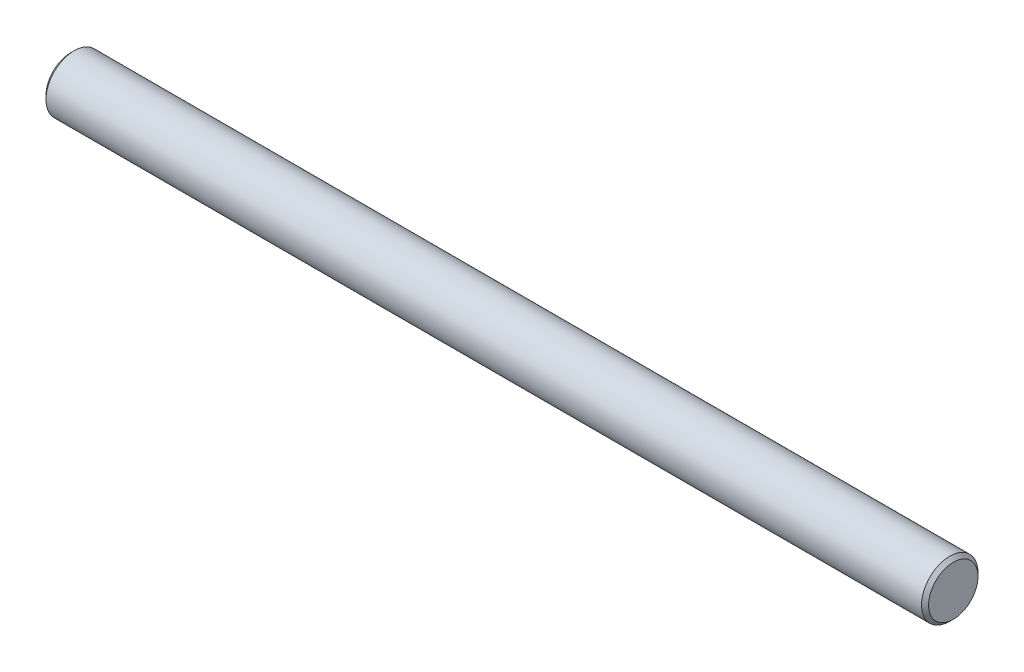
ISO-10303-21;
HEADER;
FILE_DESCRIPTION(('STEP AP214'),'2;1');
FILE_NAME('part.step','',(''),(''),'','','');
FILE_SCHEMA(('AUTOMOTIVE_DESIGN { 1 0 10303 214 1 1 1 1 }'));
ENDSEC;
DATA;
#1=APPLICATION_CONTEXT('core data for automotive mechanical design processes');
#2=APPLICATION_PROTOCOL_DEFINITION('international standard','automotive_design',2000,#1);
#3=PRODUCT_CONTEXT('',#1,'mechanical');
#4=PRODUCT('Part','Part','',(#3));
#5=PRODUCT_RELATED_PRODUCT_CATEGORY('part','',(#4));
#6=PRODUCT_DEFINITION_FORMATION('','',#4);
#7=PRODUCT_DEFINITION_CONTEXT('part definition',#1,'design');
#8=PRODUCT_DEFINITION('design','',#6,#7);
#9=PRODUCT_DEFINITION_SHAPE('','',#8);
#10=(LENGTH_UNIT() NAMED_UNIT(*) SI_UNIT(.MILLI.,.METRE.));
#11=(NAMED_UNIT(*) PLANE_ANGLE_UNIT() SI_UNIT($,.RADIAN.));
#12=(NAMED_UNIT(*) SI_UNIT($,.STERADIAN.) SOLID_ANGLE_UNIT());
#13=UNCERTAINTY_MEASURE_WITH_UNIT(LENGTH_MEASURE(1.E-05),#10,'distance_accuracy_value','');
#14=(GEOMETRIC_REPRESENTATION_CONTEXT(3) GLOBAL_UNCERTAINTY_ASSIGNED_CONTEXT((#13)) GLOBAL_UNIT_ASSIGNED_CONTEXT((#10,
#11,#12)) REPRESENTATION_CONTEXT('',''));
#15=CARTESIAN_POINT('',(0.,0.,0.));
#16=DIRECTION('',(0.,0.,1.));
#17=DIRECTION('',(1.,0.,0.));
#18=AXIS2_PLACEMENT_3D('',#15,#16,#17);
#19=CARTESIAN_POINT('',(125.,0.,0.));
#20=DIRECTION('',(-1.,0.,0.));
#21=DIRECTION('',(0.,0.,1.));
#22=AXIS2_PLACEMENT_3D('',#19,#20,#21);
#23=CYLINDRICAL_SURFACE('',#22,4.);
#24=CARTESIAN_POINT('',(124.5,0.,0.));
#25=DIRECTION('',(1.,0.,0.));
#26=DIRECTION('',(0.,0.,-1.));
#27=AXIS2_PLACEMENT_3D('',#24,#25,#26);
#28=CIRCLE('',#27,4.);
#29=CARTESIAN_POINT('',(124.5,0.,-4.));
#30=VERTEX_POINT('',#29);
#31=EDGE_CURVE('E42',#30,#30,#28,.F.);
#32=ORIENTED_EDGE('',*,*,#31,.T.);
#33=EDGE_LOOP('',(#32));
#34=FACE_BOUND('',#33,.T.);
#35=CARTESIAN_POINT('',(0.5,0.,0.));
#36=DIRECTION('',(1.,0.,0.));
#37=DIRECTION('',(0.,0.,-1.));
#38=AXIS2_PLACEMENT_3D('',#35,#36,#37);
#39=CIRCLE('',#38,4.);
#40=CARTESIAN_POINT('',(0.5,0.,-4.));
#41=VERTEX_POINT('',#40);
#42=EDGE_CURVE('E46',#41,#41,#39,.T.);
#43=ORIENTED_EDGE('',*,*,#42,.T.);
#44=EDGE_LOOP('',(#43));
#45=FACE_BOUND('',#44,.T.);
#46=ADVANCED_FACE('F35',(#34,#45),#23,.T.);
#47=CARTESIAN_POINT('',(125.,0.,0.));
#48=DIRECTION('',(1.,0.,0.));
#49=DIRECTION('',(0.,0.,-1.));
#50=AXIS2_PLACEMENT_3D('',#47,#48,#49);
#51=PLANE('',#50);
#52=CARTESIAN_POINT('',(125.,0.,0.));
#53=DIRECTION('',(1.,0.,0.));
#54=DIRECTION('',(0.,0.,-1.));
#55=AXIS2_PLACEMENT_3D('',#52,#53,#54);
#56=CIRCLE('',#55,3.49999999999999);
#57=CARTESIAN_POINT('',(125.,0.,-3.49999999999999));
#58=VERTEX_POINT('',#57);
#59=EDGE_CURVE('E50',#58,#58,#56,.T.);
#60=ORIENTED_EDGE('',*,*,#59,.T.);
#61=EDGE_LOOP('',(#60));
#62=FACE_BOUND('',#61,.T.);
#63=ADVANCED_FACE('F56',(#62),#51,.T.);
#64=CARTESIAN_POINT('',(0.,0.,0.));
#65=DIRECTION('',(1.,0.,0.));
#66=DIRECTION('',(0.,0.,-1.));
#67=AXIS2_PLACEMENT_3D('',#64,#65,#66);
#68=PLANE('',#67);
#69=CARTESIAN_POINT('',(0.,0.,0.));
#70=DIRECTION('',(1.,0.,0.));
#71=DIRECTION('',(0.,0.,-1.));
#72=AXIS2_PLACEMENT_3D('',#69,#70,#71);
#73=CIRCLE('',#72,3.50000000000002);
#74=CARTESIAN_POINT('',(0.,0.,-3.50000000000002));
#75=VERTEX_POINT('',#74);
#76=EDGE_CURVE('E10',#75,#75,#73,.F.);
#77=ORIENTED_EDGE('',*,*,#76,.T.);
#78=EDGE_LOOP('',(#77));
#79=FACE_BOUND('',#78,.T.);
#80=ADVANCED_FACE('F60',(#79),#68,.F.);
#81=CARTESIAN_POINT('',(125.,0.,0.));
#82=DIRECTION('',(-1.,0.,0.));
#83=DIRECTION('',(0.,0.,1.));
#84=AXIS2_PLACEMENT_3D('',#81,#82,#83);
#85=CONICAL_SURFACE('',#84,3.49999999999999,0.785398163397459);
#86=ORIENTED_EDGE('',*,*,#31,.F.);
#87=EDGE_LOOP('',(#86));
#88=FACE_BOUND('',#87,.T.);
#89=ORIENTED_EDGE('',*,*,#59,.F.);
#90=EDGE_LOOP('',(#89));
#91=FACE_BOUND('',#90,.T.);
#92=ADVANCED_FACE('F58',(#88,#91),#85,.T.);
#93=CARTESIAN_POINT('',(0.5,0.,0.));
#94=DIRECTION('',(1.,0.,0.));
#95=DIRECTION('',(0.,0.,-1.));
#96=AXIS2_PLACEMENT_3D('',#93,#94,#95);
#97=CONICAL_SURFACE('',#96,4.,0.785398163397431);
#98=ORIENTED_EDGE('',*,*,#76,.F.);
#99=EDGE_LOOP('',(#98));
#100=FACE_BOUND('',#99,.T.);
#101=ORIENTED_EDGE('',*,*,#42,.F.);
#102=EDGE_LOOP('',(#101));
#103=FACE_BOUND('',#102,.T.);
#104=ADVANCED_FACE('F37',(#100,#103),#97,.T.);
#105=CLOSED_SHELL('',(#46,#63,#80,#92,#104));
#106=MANIFOLD_SOLID_BREP('B2',#105);
#107=ADVANCED_BREP_SHAPE_REPRESENTATION('',(#18,#106),#14);
#108=SHAPE_DEFINITION_REPRESENTATION(#9,#107);
ENDSEC;
END-ISO-10303-21;
